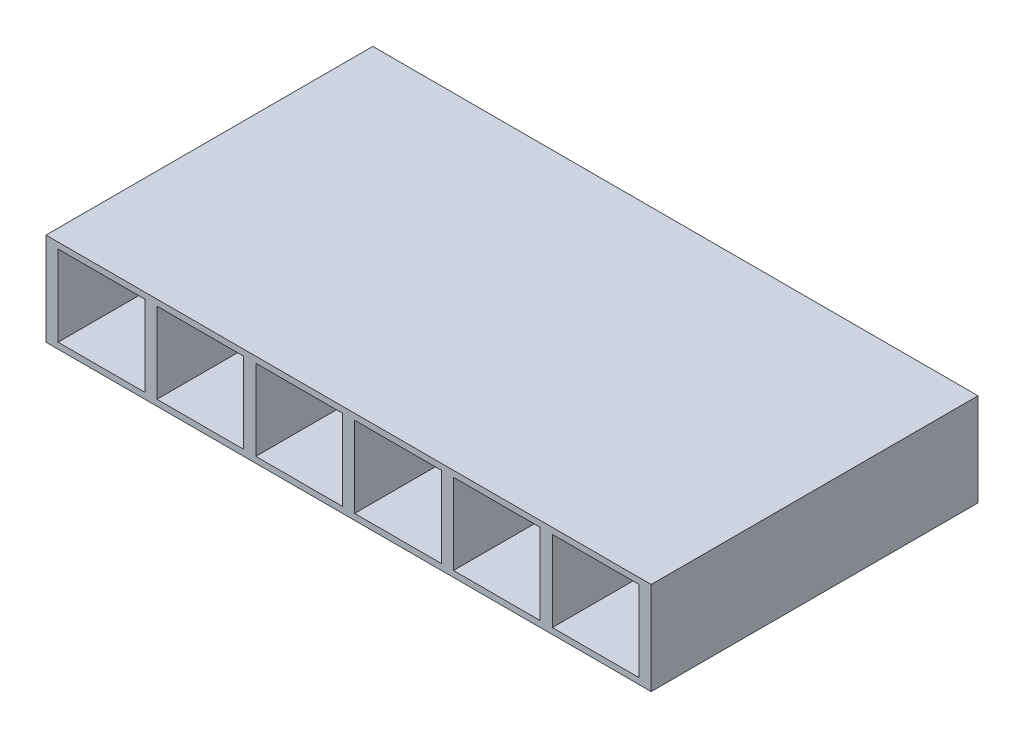
ISO-10303-21;
HEADER;
FILE_DESCRIPTION(('STEP AP214'),'2;1');
FILE_NAME('part.step','',(''),(''),'','','');
FILE_SCHEMA(('AUTOMOTIVE_DESIGN { 1 0 10303 214 1 1 1 1 }'));
ENDSEC;
DATA;
#1=APPLICATION_CONTEXT('core data for automotive mechanical design processes');
#2=APPLICATION_PROTOCOL_DEFINITION('international standard','automotive_design',2000,#1);
#3=PRODUCT_CONTEXT('',#1,'mechanical');
#4=PRODUCT('Part','Part','',(#3));
#5=PRODUCT_RELATED_PRODUCT_CATEGORY('part','',(#4));
#6=PRODUCT_DEFINITION_FORMATION('','',#4);
#7=PRODUCT_DEFINITION_CONTEXT('part definition',#1,'design');
#8=PRODUCT_DEFINITION('design','',#6,#7);
#9=PRODUCT_DEFINITION_SHAPE('','',#8);
#10=(LENGTH_UNIT() NAMED_UNIT(*) SI_UNIT(.MILLI.,.METRE.));
#11=(NAMED_UNIT(*) PLANE_ANGLE_UNIT() SI_UNIT($,.RADIAN.));
#12=(NAMED_UNIT(*) SI_UNIT($,.STERADIAN.) SOLID_ANGLE_UNIT());
#13=UNCERTAINTY_MEASURE_WITH_UNIT(LENGTH_MEASURE(1.E-05),#10,'distance_accuracy_value','');
#14=(GEOMETRIC_REPRESENTATION_CONTEXT(3) GLOBAL_UNCERTAINTY_ASSIGNED_CONTEXT((#13)) GLOBAL_UNIT_ASSIGNED_CONTEXT((#10,
#11,#12)) REPRESENTATION_CONTEXT('',''));
#15=CARTESIAN_POINT('',(0.,0.,0.));
#16=DIRECTION('',(0.,0.,1.));
#17=DIRECTION('',(1.,0.,0.));
#18=AXIS2_PLACEMENT_3D('',#15,#16,#17);
#19=CARTESIAN_POINT('',(0.,0.,8.1));
#20=DIRECTION('',(0.,0.,-1.));
#21=DIRECTION('',(-1.,0.,0.));
#22=AXIS2_PLACEMENT_3D('',#19,#20,#21);
#23=PLANE('',#22);
#24=DIRECTION('',(-1.,0.,0.));
#25=VECTOR('',#24,1.);
#26=CARTESIAN_POINT('',(2.53693586212821,1.,8.1));
#27=LINE('',#26,#25);
#28=CARTESIAN_POINT('',(4.68693586212821,1.,8.1));
#29=VERTEX_POINT('',#28);
#30=CARTESIAN_POINT('',(2.53693586212821,1.,8.1));
#31=VERTEX_POINT('',#30);
#32=EDGE_CURVE('E253',#29,#31,#27,.T.);
#33=ORIENTED_EDGE('',*,*,#32,.F.);
#34=DIRECTION('',(0.,1.,0.));
#35=VECTOR('',#34,1.);
#36=CARTESIAN_POINT('',(4.68693586212821,-1.,8.1));
#37=LINE('',#36,#35);
#38=CARTESIAN_POINT('',(4.68693586212821,-1.,8.1));
#39=VERTEX_POINT('',#38);
#40=EDGE_CURVE('E261',#39,#29,#37,.T.);
#41=ORIENTED_EDGE('',*,*,#40,.F.);
#42=DIRECTION('',(1.,0.,0.));
#43=VECTOR('',#42,1.);
#44=CARTESIAN_POINT('',(2.53693586212821,-1.,8.1));
#45=LINE('',#44,#43);
#46=CARTESIAN_POINT('',(2.53693586212821,-1.,8.1));
#47=VERTEX_POINT('',#46);
#48=EDGE_CURVE('E258',#47,#39,#45,.T.);
#49=ORIENTED_EDGE('',*,*,#48,.F.);
#50=DIRECTION('',(0.,-1.,0.));
#51=VECTOR('',#50,1.);
#52=CARTESIAN_POINT('',(2.53693586212821,-1.,8.1));
#53=LINE('',#52,#51);
#54=EDGE_CURVE('E255',#31,#47,#53,.T.);
#55=ORIENTED_EDGE('',*,*,#54,.F.);
#56=EDGE_LOOP('',(#33,#41,#49,#55));
#57=FACE_BOUND('',#56,.T.);
#58=DIRECTION('',(-1.,0.,0.));
#59=VECTOR('',#58,1.);
#60=CARTESIAN_POINT('',(-2.36306413787179,1.,8.1));
#61=LINE('',#60,#59);
#62=CARTESIAN_POINT('',(-0.213064137871794,1.,8.1));
#63=VERTEX_POINT('',#62);
#64=CARTESIAN_POINT('',(-2.36306413787179,1.,8.1));
#65=VERTEX_POINT('',#64);
#66=EDGE_CURVE('E315',#63,#65,#61,.T.);
#67=ORIENTED_EDGE('',*,*,#66,.F.);
#68=DIRECTION('',(0.,1.,0.));
#69=VECTOR('',#68,1.);
#70=CARTESIAN_POINT('',(-0.213064137871794,-1.,8.1));
#71=LINE('',#70,#69);
#72=CARTESIAN_POINT('',(-0.213064137871794,-1.,8.1));
#73=VERTEX_POINT('',#72);
#74=EDGE_CURVE('E323',#73,#63,#71,.T.);
#75=ORIENTED_EDGE('',*,*,#74,.F.);
#76=DIRECTION('',(1.,0.,0.));
#77=VECTOR('',#76,1.);
#78=CARTESIAN_POINT('',(-2.36306413787179,-1.,8.1));
#79=LINE('',#78,#77);
#80=CARTESIAN_POINT('',(-2.36306413787179,-1.,8.1));
#81=VERTEX_POINT('',#80);
#82=EDGE_CURVE('E320',#81,#73,#79,.T.);
#83=ORIENTED_EDGE('',*,*,#82,.F.);
#84=DIRECTION('',(0.,-1.,0.));
#85=VECTOR('',#84,1.);
#86=CARTESIAN_POINT('',(-2.36306413787179,-1.,8.1));
#87=LINE('',#86,#85);
#88=EDGE_CURVE('E317',#65,#81,#87,.T.);
#89=ORIENTED_EDGE('',*,*,#88,.F.);
#90=EDGE_LOOP('',(#67,#75,#83,#89));
#91=FACE_BOUND('',#90,.T.);
#92=DIRECTION('',(0.,1.,0.));
#93=VECTOR('',#92,1.);
#94=CARTESIAN_POINT('',(-5.11306413787179,-1.,8.1));
#95=LINE('',#94,#93);
#96=CARTESIAN_POINT('',(-5.11306413787179,-1.,8.1));
#97=VERTEX_POINT('',#96);
#98=CARTESIAN_POINT('',(-5.11306413787179,1.,8.1));
#99=VERTEX_POINT('',#98);
#100=EDGE_CURVE('E377',#97,#99,#95,.T.);
#101=ORIENTED_EDGE('',*,*,#100,.F.);
#102=DIRECTION('',(1.,0.,0.));
#103=VECTOR('',#102,1.);
#104=CARTESIAN_POINT('',(-7.26306413787179,-1.,8.1));
#105=LINE('',#104,#103);
#106=CARTESIAN_POINT('',(-7.26306413787179,-1.,8.1));
#107=VERTEX_POINT('',#106);
#108=EDGE_CURVE('E385',#107,#97,#105,.T.);
#109=ORIENTED_EDGE('',*,*,#108,.F.);
#110=DIRECTION('',(0.,-1.,0.));
#111=VECTOR('',#110,1.);
#112=CARTESIAN_POINT('',(-7.26306413787179,-1.,8.1));
#113=LINE('',#112,#111);
#114=CARTESIAN_POINT('',(-7.26306413787179,1.,8.1));
#115=VERTEX_POINT('',#114);
#116=EDGE_CURVE('E382',#115,#107,#113,.T.);
#117=ORIENTED_EDGE('',*,*,#116,.F.);
#118=DIRECTION('',(-1.,0.,0.));
#119=VECTOR('',#118,1.);
#120=CARTESIAN_POINT('',(-7.26306413787179,1.,8.1));
#121=LINE('',#120,#119);
#122=EDGE_CURVE('E379',#99,#115,#121,.T.);
#123=ORIENTED_EDGE('',*,*,#122,.F.);
#124=EDGE_LOOP('',(#101,#109,#117,#123));
#125=FACE_BOUND('',#124,.T.);
#126=DIRECTION('',(0.,1.,0.));
#127=VECTOR('',#126,1.);
#128=CARTESIAN_POINT('',(7.43693586212821,-1.15,8.1));
#129=LINE('',#128,#127);
#130=CARTESIAN_POINT('',(7.43693586212821,-1.15,8.1));
#131=VERTEX_POINT('',#130);
#132=CARTESIAN_POINT('',(7.43693586212821,1.15,8.1));
#133=VERTEX_POINT('',#132);
#134=EDGE_CURVE('E408',#131,#133,#129,.T.);
#135=ORIENTED_EDGE('',*,*,#134,.T.);
#136=DIRECTION('',(-1.,0.,0.));
#137=VECTOR('',#136,1.);
#138=CARTESIAN_POINT('',(-7.56306413787179,1.15,8.1));
#139=LINE('',#138,#137);
#140=CARTESIAN_POINT('',(-7.56306413787179,1.15,8.1));
#141=VERTEX_POINT('',#140);
#142=EDGE_CURVE('E411',#133,#141,#139,.T.);
#143=ORIENTED_EDGE('',*,*,#142,.T.);
#144=DIRECTION('',(0.,-1.,0.));
#145=VECTOR('',#144,1.);
#146=CARTESIAN_POINT('',(-7.5630641378718,-1.15,8.1));
#147=LINE('',#146,#145);
#148=CARTESIAN_POINT('',(-7.5630641378718,-1.15,8.1));
#149=VERTEX_POINT('',#148);
#150=EDGE_CURVE('E414',#141,#149,#147,.T.);
#151=ORIENTED_EDGE('',*,*,#150,.T.);
#152=DIRECTION('',(1.,0.,0.));
#153=VECTOR('',#152,1.);
#154=CARTESIAN_POINT('',(-7.5630641378718,-1.15,8.1));
#155=LINE('',#154,#153);
#156=EDGE_CURVE('E416',#149,#131,#155,.T.);
#157=ORIENTED_EDGE('',*,*,#156,.T.);
#158=EDGE_LOOP('',(#135,#143,#151,#157));
#159=FACE_BOUND('',#158,.T.);
#160=DIRECTION('',(-1.,0.,0.));
#161=VECTOR('',#160,1.);
#162=CARTESIAN_POINT('',(-4.81306413787179,1.,8.1));
#163=LINE('',#162,#161);
#164=CARTESIAN_POINT('',(-2.66306413787179,1.,8.1));
#165=VERTEX_POINT('',#164);
#166=CARTESIAN_POINT('',(-4.81306413787179,1.,8.1));
#167=VERTEX_POINT('',#166);
#168=EDGE_CURVE('E346',#165,#167,#163,.T.);
#169=ORIENTED_EDGE('',*,*,#168,.F.);
#170=DIRECTION('',(0.,1.,0.));
#171=VECTOR('',#170,1.);
#172=CARTESIAN_POINT('',(-2.66306413787179,-1.,8.1));
#173=LINE('',#172,#171);
#174=CARTESIAN_POINT('',(-2.66306413787179,-1.,8.1));
#175=VERTEX_POINT('',#174);
#176=EDGE_CURVE('E354',#175,#165,#173,.T.);
#177=ORIENTED_EDGE('',*,*,#176,.F.);
#178=DIRECTION('',(1.,0.,0.));
#179=VECTOR('',#178,1.);
#180=CARTESIAN_POINT('',(-4.81306413787179,-1.,8.1));
#181=LINE('',#180,#179);
#182=CARTESIAN_POINT('',(-4.81306413787179,-1.,8.1));
#183=VERTEX_POINT('',#182);
#184=EDGE_CURVE('E351',#183,#175,#181,.T.);
#185=ORIENTED_EDGE('',*,*,#184,.F.);
#186=DIRECTION('',(0.,-1.,0.));
#187=VECTOR('',#186,1.);
#188=CARTESIAN_POINT('',(-4.81306413787179,-1.,8.1));
#189=LINE('',#188,#187);
#190=EDGE_CURVE('E348',#167,#183,#189,.T.);
#191=ORIENTED_EDGE('',*,*,#190,.F.);
#192=EDGE_LOOP('',(#169,#177,#185,#191));
#193=FACE_BOUND('',#192,.T.);
#194=DIRECTION('',(-1.,0.,0.));
#195=VECTOR('',#194,1.);
#196=CARTESIAN_POINT('',(0.0869358621282063,1.,8.1));
#197=LINE('',#196,#195);
#198=CARTESIAN_POINT('',(2.23693586212821,1.,8.1));
#199=VERTEX_POINT('',#198);
#200=CARTESIAN_POINT('',(0.0869358621282063,1.,8.1));
#201=VERTEX_POINT('',#200);
#202=EDGE_CURVE('E284',#199,#201,#197,.T.);
#203=ORIENTED_EDGE('',*,*,#202,.F.);
#204=DIRECTION('',(0.,1.,0.));
#205=VECTOR('',#204,1.);
#206=CARTESIAN_POINT('',(2.23693586212821,-1.,8.1));
#207=LINE('',#206,#205);
#208=CARTESIAN_POINT('',(2.23693586212821,-1.,8.1));
#209=VERTEX_POINT('',#208);
#210=EDGE_CURVE('E292',#209,#199,#207,.T.);
#211=ORIENTED_EDGE('',*,*,#210,.F.);
#212=DIRECTION('',(1.,0.,0.));
#213=VECTOR('',#212,1.);
#214=CARTESIAN_POINT('',(0.0869358621282063,-1.,8.1));
#215=LINE('',#214,#213);
#216=CARTESIAN_POINT('',(0.0869358621282063,-1.,8.1));
#217=VERTEX_POINT('',#216);
#218=EDGE_CURVE('E289',#217,#209,#215,.T.);
#219=ORIENTED_EDGE('',*,*,#218,.F.);
#220=DIRECTION('',(0.,-1.,0.));
#221=VECTOR('',#220,1.);
#222=CARTESIAN_POINT('',(0.0869358621282063,-1.,8.1));
#223=LINE('',#222,#221);
#224=EDGE_CURVE('E286',#201,#217,#223,.T.);
#225=ORIENTED_EDGE('',*,*,#224,.F.);
#226=EDGE_LOOP('',(#203,#211,#219,#225));
#227=FACE_BOUND('',#226,.T.);
#228=DIRECTION('',(-1.,0.,0.));
#229=VECTOR('',#228,1.);
#230=CARTESIAN_POINT('',(4.98693586212821,1.,8.1));
#231=LINE('',#230,#229);
#232=CARTESIAN_POINT('',(7.13693586212821,1.,8.1));
#233=VERTEX_POINT('',#232);
#234=CARTESIAN_POINT('',(4.98693586212821,1.,8.1));
#235=VERTEX_POINT('',#234);
#236=EDGE_CURVE('E217',#233,#235,#231,.T.);
#237=ORIENTED_EDGE('',*,*,#236,.F.);
#238=DIRECTION('',(0.,1.,0.));
#239=VECTOR('',#238,1.);
#240=CARTESIAN_POINT('',(7.13693586212821,-1.,8.1));
#241=LINE('',#240,#239);
#242=CARTESIAN_POINT('',(7.13693586212821,-1.,8.1));
#243=VERTEX_POINT('',#242);
#244=EDGE_CURVE('E239',#243,#233,#241,.T.);
#245=ORIENTED_EDGE('',*,*,#244,.F.);
#246=DIRECTION('',(1.,0.,0.));
#247=VECTOR('',#246,1.);
#248=CARTESIAN_POINT('',(4.98693586212821,-1.,8.1));
#249=LINE('',#248,#247);
#250=CARTESIAN_POINT('',(4.98693586212821,-1.,8.1));
#251=VERTEX_POINT('',#250);
#252=EDGE_CURVE('E237',#251,#243,#249,.T.);
#253=ORIENTED_EDGE('',*,*,#252,.F.);
#254=DIRECTION('',(0.,-1.,0.));
#255=VECTOR('',#254,1.);
#256=CARTESIAN_POINT('',(4.98693586212821,-1.,8.1));
#257=LINE('',#256,#255);
#258=EDGE_CURVE('E225',#235,#251,#257,.T.);
#259=ORIENTED_EDGE('',*,*,#258,.F.);
#260=EDGE_LOOP('',(#237,#245,#253,#259));
#261=FACE_BOUND('',#260,.T.);
#262=ADVANCED_FACE('F32',(#57,#91,#125,#159,#193,#227,#261),#23,.F.);
#263=CARTESIAN_POINT('',(0.,0.,0.));
#264=DIRECTION('',(0.,0.,-1.));
#265=DIRECTION('',(-1.,0.,0.));
#266=AXIS2_PLACEMENT_3D('',#263,#264,#265);
#267=PLANE('',#266);
#268=DIRECTION('',(0.,1.,0.));
#269=VECTOR('',#268,1.);
#270=CARTESIAN_POINT('',(7.43693586212821,-1.15,0.));
#271=LINE('',#270,#269);
#272=CARTESIAN_POINT('',(7.43693586212821,-1.15,0.));
#273=VERTEX_POINT('',#272);
#274=CARTESIAN_POINT('',(7.43693586212821,1.15,0.));
#275=VERTEX_POINT('',#274);
#276=EDGE_CURVE('E407',#273,#275,#271,.T.);
#277=ORIENTED_EDGE('',*,*,#276,.F.);
#278=DIRECTION('',(1.,0.,0.));
#279=VECTOR('',#278,1.);
#280=CARTESIAN_POINT('',(-7.5630641378718,-1.15,0.));
#281=LINE('',#280,#279);
#282=CARTESIAN_POINT('',(-7.5630641378718,-1.15,0.));
#283=VERTEX_POINT('',#282);
#284=EDGE_CURVE('E412',#283,#273,#281,.T.);
#285=ORIENTED_EDGE('',*,*,#284,.F.);
#286=DIRECTION('',(0.,-1.,0.));
#287=VECTOR('',#286,1.);
#288=CARTESIAN_POINT('',(-7.5630641378718,-1.15,0.));
#289=LINE('',#288,#287);
#290=CARTESIAN_POINT('',(-7.56306413787179,1.15,0.));
#291=VERTEX_POINT('',#290);
#292=EDGE_CURVE('E423',#291,#283,#289,.T.);
#293=ORIENTED_EDGE('',*,*,#292,.F.);
#294=DIRECTION('',(-1.,0.,0.));
#295=VECTOR('',#294,1.);
#296=CARTESIAN_POINT('',(-7.56306413787179,1.15,0.));
#297=LINE('',#296,#295);
#298=EDGE_CURVE('E421',#275,#291,#297,.T.);
#299=ORIENTED_EDGE('',*,*,#298,.F.);
#300=EDGE_LOOP('',(#277,#285,#293,#299));
#301=FACE_BOUND('',#300,.T.);
#302=DIRECTION('',(1.,0.,0.));
#303=VECTOR('',#302,1.);
#304=CARTESIAN_POINT('',(-7.26306413787179,-1.,0.));
#305=LINE('',#304,#303);
#306=CARTESIAN_POINT('',(-7.26306413787179,-1.,0.));
#307=VERTEX_POINT('',#306);
#308=CARTESIAN_POINT('',(-5.11306413787179,-1.,0.));
#309=VERTEX_POINT('',#308);
#310=EDGE_CURVE('E380',#307,#309,#305,.T.);
#311=ORIENTED_EDGE('',*,*,#310,.T.);
#312=DIRECTION('',(0.,1.,0.));
#313=VECTOR('',#312,1.);
#314=CARTESIAN_POINT('',(-5.11306413787179,-1.,0.));
#315=LINE('',#314,#313);
#316=CARTESIAN_POINT('',(-5.11306413787179,1.,0.));
#317=VERTEX_POINT('',#316);
#318=EDGE_CURVE('E376',#309,#317,#315,.T.);
#319=ORIENTED_EDGE('',*,*,#318,.T.);
#320=DIRECTION('',(-1.,0.,0.));
#321=VECTOR('',#320,1.);
#322=CARTESIAN_POINT('',(-7.26306413787179,1.,0.));
#323=LINE('',#322,#321);
#324=CARTESIAN_POINT('',(-7.26306413787179,1.,0.));
#325=VERTEX_POINT('',#324);
#326=EDGE_CURVE('E390',#317,#325,#323,.T.);
#327=ORIENTED_EDGE('',*,*,#326,.T.);
#328=DIRECTION('',(0.,-1.,0.));
#329=VECTOR('',#328,1.);
#330=CARTESIAN_POINT('',(-7.26306413787179,-1.,0.));
#331=LINE('',#330,#329);
#332=EDGE_CURVE('E393',#325,#307,#331,.T.);
#333=ORIENTED_EDGE('',*,*,#332,.T.);
#334=EDGE_LOOP('',(#311,#319,#327,#333));
#335=FACE_BOUND('',#334,.T.);
#336=DIRECTION('',(0.,1.,0.));
#337=VECTOR('',#336,1.);
#338=CARTESIAN_POINT('',(-2.66306413787179,-1.,0.));
#339=LINE('',#338,#337);
#340=CARTESIAN_POINT('',(-2.66306413787179,-1.,0.));
#341=VERTEX_POINT('',#340);
#342=CARTESIAN_POINT('',(-2.66306413787179,1.,0.));
#343=VERTEX_POINT('',#342);
#344=EDGE_CURVE('E349',#341,#343,#339,.T.);
#345=ORIENTED_EDGE('',*,*,#344,.T.);
#346=DIRECTION('',(-1.,0.,0.));
#347=VECTOR('',#346,1.);
#348=CARTESIAN_POINT('',(-4.81306413787179,1.,0.));
#349=LINE('',#348,#347);
#350=CARTESIAN_POINT('',(-4.81306413787179,1.,0.));
#351=VERTEX_POINT('',#350);
#352=EDGE_CURVE('E345',#343,#351,#349,.T.);
#353=ORIENTED_EDGE('',*,*,#352,.T.);
#354=DIRECTION('',(0.,-1.,0.));
#355=VECTOR('',#354,1.);
#356=CARTESIAN_POINT('',(-4.81306413787179,-1.,0.));
#357=LINE('',#356,#355);
#358=CARTESIAN_POINT('',(-4.81306413787179,-1.,0.));
#359=VERTEX_POINT('',#358);
#360=EDGE_CURVE('E359',#351,#359,#357,.T.);
#361=ORIENTED_EDGE('',*,*,#360,.T.);
#362=DIRECTION('',(1.,0.,0.));
#363=VECTOR('',#362,1.);
#364=CARTESIAN_POINT('',(-4.81306413787179,-1.,0.));
#365=LINE('',#364,#363);
#366=EDGE_CURVE('E362',#359,#341,#365,.T.);
#367=ORIENTED_EDGE('',*,*,#366,.T.);
#368=EDGE_LOOP('',(#345,#353,#361,#367));
#369=FACE_BOUND('',#368,.T.);
#370=DIRECTION('',(0.,1.,0.));
#371=VECTOR('',#370,1.);
#372=CARTESIAN_POINT('',(-0.213064137871794,-1.,0.));
#373=LINE('',#372,#371);
#374=CARTESIAN_POINT('',(-0.213064137871794,-1.,0.));
#375=VERTEX_POINT('',#374);
#376=CARTESIAN_POINT('',(-0.213064137871794,1.,0.));
#377=VERTEX_POINT('',#376);
#378=EDGE_CURVE('E318',#375,#377,#373,.T.);
#379=ORIENTED_EDGE('',*,*,#378,.T.);
#380=DIRECTION('',(-1.,0.,0.));
#381=VECTOR('',#380,1.);
#382=CARTESIAN_POINT('',(-2.36306413787179,1.,0.));
#383=LINE('',#382,#381);
#384=CARTESIAN_POINT('',(-2.36306413787179,1.,0.));
#385=VERTEX_POINT('',#384);
#386=EDGE_CURVE('E314',#377,#385,#383,.T.);
#387=ORIENTED_EDGE('',*,*,#386,.T.);
#388=DIRECTION('',(0.,-1.,0.));
#389=VECTOR('',#388,1.);
#390=CARTESIAN_POINT('',(-2.36306413787179,-1.,0.));
#391=LINE('',#390,#389);
#392=CARTESIAN_POINT('',(-2.36306413787179,-1.,0.));
#393=VERTEX_POINT('',#392);
#394=EDGE_CURVE('E328',#385,#393,#391,.T.);
#395=ORIENTED_EDGE('',*,*,#394,.T.);
#396=DIRECTION('',(1.,0.,0.));
#397=VECTOR('',#396,1.);
#398=CARTESIAN_POINT('',(-2.36306413787179,-1.,0.));
#399=LINE('',#398,#397);
#400=EDGE_CURVE('E331',#393,#375,#399,.T.);
#401=ORIENTED_EDGE('',*,*,#400,.T.);
#402=EDGE_LOOP('',(#379,#387,#395,#401));
#403=FACE_BOUND('',#402,.T.);
#404=DIRECTION('',(0.,1.,0.));
#405=VECTOR('',#404,1.);
#406=CARTESIAN_POINT('',(2.23693586212821,-1.,0.));
#407=LINE('',#406,#405);
#408=CARTESIAN_POINT('',(2.23693586212821,-1.,0.));
#409=VERTEX_POINT('',#408);
#410=CARTESIAN_POINT('',(2.23693586212821,1.,0.));
#411=VERTEX_POINT('',#410);
#412=EDGE_CURVE('E287',#409,#411,#407,.T.);
#413=ORIENTED_EDGE('',*,*,#412,.T.);
#414=DIRECTION('',(-1.,0.,0.));
#415=VECTOR('',#414,1.);
#416=CARTESIAN_POINT('',(0.0869358621282063,1.,0.));
#417=LINE('',#416,#415);
#418=CARTESIAN_POINT('',(0.0869358621282063,1.,0.));
#419=VERTEX_POINT('',#418);
#420=EDGE_CURVE('E283',#411,#419,#417,.T.);
#421=ORIENTED_EDGE('',*,*,#420,.T.);
#422=DIRECTION('',(0.,-1.,0.));
#423=VECTOR('',#422,1.);
#424=CARTESIAN_POINT('',(0.0869358621282063,-1.,0.));
#425=LINE('',#424,#423);
#426=CARTESIAN_POINT('',(0.0869358621282063,-1.,0.));
#427=VERTEX_POINT('',#426);
#428=EDGE_CURVE('E297',#419,#427,#425,.T.);
#429=ORIENTED_EDGE('',*,*,#428,.T.);
#430=DIRECTION('',(1.,0.,0.));
#431=VECTOR('',#430,1.);
#432=CARTESIAN_POINT('',(0.0869358621282063,-1.,0.));
#433=LINE('',#432,#431);
#434=EDGE_CURVE('E300',#427,#409,#433,.T.);
#435=ORIENTED_EDGE('',*,*,#434,.T.);
#436=EDGE_LOOP('',(#413,#421,#429,#435));
#437=FACE_BOUND('',#436,.T.);
#438=DIRECTION('',(0.,1.,0.));
#439=VECTOR('',#438,1.);
#440=CARTESIAN_POINT('',(4.68693586212821,-1.,0.));
#441=LINE('',#440,#439);
#442=CARTESIAN_POINT('',(4.68693586212821,-1.,0.));
#443=VERTEX_POINT('',#442);
#444=CARTESIAN_POINT('',(4.68693586212821,1.,0.));
#445=VERTEX_POINT('',#444);
#446=EDGE_CURVE('E256',#443,#445,#441,.T.);
#447=ORIENTED_EDGE('',*,*,#446,.T.);
#448=DIRECTION('',(-1.,0.,0.));
#449=VECTOR('',#448,1.);
#450=CARTESIAN_POINT('',(2.53693586212821,1.,0.));
#451=LINE('',#450,#449);
#452=CARTESIAN_POINT('',(2.53693586212821,1.,0.));
#453=VERTEX_POINT('',#452);
#454=EDGE_CURVE('E233',#445,#453,#451,.T.);
#455=ORIENTED_EDGE('',*,*,#454,.T.);
#456=DIRECTION('',(0.,-1.,0.));
#457=VECTOR('',#456,1.);
#458=CARTESIAN_POINT('',(2.53693586212821,-1.,0.));
#459=LINE('',#458,#457);
#460=CARTESIAN_POINT('',(2.53693586212821,-1.,0.));
#461=VERTEX_POINT('',#460);
#462=EDGE_CURVE('E266',#453,#461,#459,.T.);
#463=ORIENTED_EDGE('',*,*,#462,.T.);
#464=DIRECTION('',(1.,0.,0.));
#465=VECTOR('',#464,1.);
#466=CARTESIAN_POINT('',(2.53693586212821,-1.,0.));
#467=LINE('',#466,#465);
#468=EDGE_CURVE('E269',#461,#443,#467,.T.);
#469=ORIENTED_EDGE('',*,*,#468,.T.);
#470=EDGE_LOOP('',(#447,#455,#463,#469));
#471=FACE_BOUND('',#470,.T.);
#472=DIRECTION('',(0.,1.,0.));
#473=VECTOR('',#472,1.);
#474=CARTESIAN_POINT('',(7.13693586212821,-1.,0.));
#475=LINE('',#474,#473);
#476=CARTESIAN_POINT('',(7.13693586212821,-1.,0.));
#477=VERTEX_POINT('',#476);
#478=CARTESIAN_POINT('',(7.13693586212821,1.,0.));
#479=VERTEX_POINT('',#478);
#480=EDGE_CURVE('E226',#477,#479,#475,.T.);
#481=ORIENTED_EDGE('',*,*,#480,.T.);
#482=DIRECTION('',(-1.,0.,0.));
#483=VECTOR('',#482,1.);
#484=CARTESIAN_POINT('',(4.98693586212821,1.,0.));
#485=LINE('',#484,#483);
#486=CARTESIAN_POINT('',(4.98693586212821,1.,0.));
#487=VERTEX_POINT('',#486);
#488=EDGE_CURVE('E55',#479,#487,#485,.T.);
#489=ORIENTED_EDGE('',*,*,#488,.T.);
#490=DIRECTION('',(0.,-1.,0.));
#491=VECTOR('',#490,1.);
#492=CARTESIAN_POINT('',(4.98693586212821,-1.,0.));
#493=LINE('',#492,#491);
#494=CARTESIAN_POINT('',(4.98693586212821,-1.,0.));
#495=VERTEX_POINT('',#494);
#496=EDGE_CURVE('E232',#487,#495,#493,.T.);
#497=ORIENTED_EDGE('',*,*,#496,.T.);
#498=DIRECTION('',(1.,0.,0.));
#499=VECTOR('',#498,1.);
#500=CARTESIAN_POINT('',(4.98693586212821,-1.,0.));
#501=LINE('',#500,#499);
#502=EDGE_CURVE('E245',#495,#477,#501,.T.);
#503=ORIENTED_EDGE('',*,*,#502,.T.);
#504=EDGE_LOOP('',(#481,#489,#497,#503));
#505=FACE_BOUND('',#504,.T.);
#506=ADVANCED_FACE('F441',(#301,#335,#369,#403,#437,#471,#505),#267,.T.);
#507=CARTESIAN_POINT('',(7.43693586212821,-1.15,8.1));
#508=DIRECTION('',(-1.,0.,0.));
#509=DIRECTION('',(0.,-1.,0.));
#510=AXIS2_PLACEMENT_3D('',#507,#508,#509);
#511=PLANE('',#510);
#512=ORIENTED_EDGE('',*,*,#276,.T.);
#513=DIRECTION('',(0.,0.,-1.));
#514=VECTOR('',#513,1.);
#515=CARTESIAN_POINT('',(7.43693586212821,1.15,8.1));
#516=LINE('',#515,#514);
#517=EDGE_CURVE('E11',#133,#275,#516,.T.);
#518=ORIENTED_EDGE('',*,*,#517,.F.);
#519=ORIENTED_EDGE('',*,*,#134,.F.);
#520=DIRECTION('',(0.,0.,-1.));
#521=VECTOR('',#520,1.);
#522=CARTESIAN_POINT('',(7.43693586212821,-1.15,8.1));
#523=LINE('',#522,#521);
#524=EDGE_CURVE('E418',#131,#273,#523,.T.);
#525=ORIENTED_EDGE('',*,*,#524,.T.);
#526=EDGE_LOOP('',(#512,#518,#519,#525));
#527=FACE_BOUND('',#526,.T.);
#528=ADVANCED_FACE('F34',(#527),#511,.F.);
#529=CARTESIAN_POINT('',(-7.56306413787179,1.15,8.1));
#530=DIRECTION('',(0.,-1.,0.));
#531=DIRECTION('',(0.,0.,-1.));
#532=AXIS2_PLACEMENT_3D('',#529,#530,#531);
#533=PLANE('',#532);
#534=ORIENTED_EDGE('',*,*,#298,.T.);
#535=DIRECTION('',(0.,0.,-1.));
#536=VECTOR('',#535,1.);
#537=CARTESIAN_POINT('',(-7.56306413787179,1.15,8.1));
#538=LINE('',#537,#536);
#539=EDGE_CURVE('E40',#141,#291,#538,.T.);
#540=ORIENTED_EDGE('',*,*,#539,.F.);
#541=ORIENTED_EDGE('',*,*,#142,.F.);
#542=ORIENTED_EDGE('',*,*,#517,.T.);
#543=EDGE_LOOP('',(#534,#540,#541,#542));
#544=FACE_BOUND('',#543,.T.);
#545=ADVANCED_FACE('F452',(#544),#533,.F.);
#546=CARTESIAN_POINT('',(-7.5630641378718,-1.15,8.1));
#547=DIRECTION('',(1.,0.,0.));
#548=DIRECTION('',(0.,1.,0.));
#549=AXIS2_PLACEMENT_3D('',#546,#547,#548);
#550=PLANE('',#549);
#551=ORIENTED_EDGE('',*,*,#292,.T.);
#552=DIRECTION('',(0.,0.,-1.));
#553=VECTOR('',#552,1.);
#554=CARTESIAN_POINT('',(-7.5630641378718,-1.15,8.1));
#555=LINE('',#554,#553);
#556=EDGE_CURVE('E428',#149,#283,#555,.T.);
#557=ORIENTED_EDGE('',*,*,#556,.F.);
#558=ORIENTED_EDGE('',*,*,#150,.F.);
#559=ORIENTED_EDGE('',*,*,#539,.T.);
#560=EDGE_LOOP('',(#551,#557,#558,#559));
#561=FACE_BOUND('',#560,.T.);
#562=ADVANCED_FACE('F435',(#561),#550,.F.);
#563=CARTESIAN_POINT('',(-7.5630641378718,-1.15,8.1));
#564=DIRECTION('',(0.,1.,0.));
#565=DIRECTION('',(0.,0.,1.));
#566=AXIS2_PLACEMENT_3D('',#563,#564,#565);
#567=PLANE('',#566);
#568=ORIENTED_EDGE('',*,*,#284,.T.);
#569=ORIENTED_EDGE('',*,*,#524,.F.);
#570=ORIENTED_EDGE('',*,*,#156,.F.);
#571=ORIENTED_EDGE('',*,*,#556,.T.);
#572=EDGE_LOOP('',(#568,#569,#570,#571));
#573=FACE_BOUND('',#572,.T.);
#574=ADVANCED_FACE('F445',(#573),#567,.F.);
#575=CARTESIAN_POINT('',(-5.11306413787179,-1.,8.1));
#576=DIRECTION('',(-1.,0.,0.));
#577=DIRECTION('',(0.,0.,1.));
#578=AXIS2_PLACEMENT_3D('',#575,#576,#577);
#579=PLANE('',#578);
#580=ORIENTED_EDGE('',*,*,#318,.F.);
#581=DIRECTION('',(0.,0.,-1.));
#582=VECTOR('',#581,1.);
#583=CARTESIAN_POINT('',(-5.11306413787179,-1.,8.1));
#584=LINE('',#583,#582);
#585=EDGE_CURVE('E387',#97,#309,#584,.T.);
#586=ORIENTED_EDGE('',*,*,#585,.F.);
#587=ORIENTED_EDGE('',*,*,#100,.T.);
#588=DIRECTION('',(0.,0.,-1.));
#589=VECTOR('',#588,1.);
#590=CARTESIAN_POINT('',(-5.11306413787179,1.,8.1));
#591=LINE('',#590,#589);
#592=EDGE_CURVE('E404',#99,#317,#591,.T.);
#593=ORIENTED_EDGE('',*,*,#592,.T.);
#594=EDGE_LOOP('',(#580,#586,#587,#593));
#595=FACE_BOUND('',#594,.T.);
#596=ADVANCED_FACE('F469',(#595),#579,.T.);
#597=CARTESIAN_POINT('',(-7.26306413787179,1.,8.1));
#598=DIRECTION('',(0.,-1.,0.));
#599=DIRECTION('',(0.,0.,-1.));
#600=AXIS2_PLACEMENT_3D('',#597,#598,#599);
#601=PLANE('',#600);
#602=ORIENTED_EDGE('',*,*,#326,.F.);
#603=ORIENTED_EDGE('',*,*,#592,.F.);
#604=ORIENTED_EDGE('',*,*,#122,.T.);
#605=DIRECTION('',(0.,0.,-1.));
#606=VECTOR('',#605,1.);
#607=CARTESIAN_POINT('',(-7.26306413787179,1.,8.1));
#608=LINE('',#607,#606);
#609=EDGE_CURVE('E402',#115,#325,#608,.T.);
#610=ORIENTED_EDGE('',*,*,#609,.T.);
#611=EDGE_LOOP('',(#602,#603,#604,#610));
#612=FACE_BOUND('',#611,.T.);
#613=ADVANCED_FACE('F476',(#612),#601,.T.);
#614=CARTESIAN_POINT('',(-7.26306413787179,-1.,8.1));
#615=DIRECTION('',(1.,0.,0.));
#616=DIRECTION('',(0.,0.,-1.));
#617=AXIS2_PLACEMENT_3D('',#614,#615,#616);
#618=PLANE('',#617);
#619=ORIENTED_EDGE('',*,*,#332,.F.);
#620=ORIENTED_EDGE('',*,*,#609,.F.);
#621=ORIENTED_EDGE('',*,*,#116,.T.);
#622=DIRECTION('',(0.,0.,-1.));
#623=VECTOR('',#622,1.);
#624=CARTESIAN_POINT('',(-7.26306413787179,-1.,8.1));
#625=LINE('',#624,#623);
#626=EDGE_CURVE('E400',#107,#307,#625,.T.);
#627=ORIENTED_EDGE('',*,*,#626,.T.);
#628=EDGE_LOOP('',(#619,#620,#621,#627));
#629=FACE_BOUND('',#628,.T.);
#630=ADVANCED_FACE('F481',(#629),#618,.T.);
#631=CARTESIAN_POINT('',(-7.26306413787179,-1.,8.1));
#632=DIRECTION('',(0.,1.,0.));
#633=DIRECTION('',(0.,0.,1.));
#634=AXIS2_PLACEMENT_3D('',#631,#632,#633);
#635=PLANE('',#634);
#636=ORIENTED_EDGE('',*,*,#310,.F.);
#637=ORIENTED_EDGE('',*,*,#626,.F.);
#638=ORIENTED_EDGE('',*,*,#108,.T.);
#639=ORIENTED_EDGE('',*,*,#585,.T.);
#640=EDGE_LOOP('',(#636,#637,#638,#639));
#641=FACE_BOUND('',#640,.T.);
#642=ADVANCED_FACE('F488',(#641),#635,.T.);
#643=CARTESIAN_POINT('',(-4.81306413787179,1.,8.1));
#644=DIRECTION('',(0.,-1.,0.));
#645=DIRECTION('',(0.,0.,-1.));
#646=AXIS2_PLACEMENT_3D('',#643,#644,#645);
#647=PLANE('',#646);
#648=ORIENTED_EDGE('',*,*,#352,.F.);
#649=DIRECTION('',(0.,0.,-1.));
#650=VECTOR('',#649,1.);
#651=CARTESIAN_POINT('',(-2.66306413787179,1.,8.1));
#652=LINE('',#651,#650);
#653=EDGE_CURVE('E356',#165,#343,#652,.T.);
#654=ORIENTED_EDGE('',*,*,#653,.F.);
#655=ORIENTED_EDGE('',*,*,#168,.T.);
#656=DIRECTION('',(0.,0.,-1.));
#657=VECTOR('',#656,1.);
#658=CARTESIAN_POINT('',(-4.81306413787179,1.,8.1));
#659=LINE('',#658,#657);
#660=EDGE_CURVE('E373',#167,#351,#659,.T.);
#661=ORIENTED_EDGE('',*,*,#660,.T.);
#662=EDGE_LOOP('',(#648,#654,#655,#661));
#663=FACE_BOUND('',#662,.T.);
#664=ADVANCED_FACE('F502',(#663),#647,.T.);
#665=CARTESIAN_POINT('',(-4.81306413787179,-1.,8.1));
#666=DIRECTION('',(1.,0.,0.));
#667=DIRECTION('',(0.,0.,-1.));
#668=AXIS2_PLACEMENT_3D('',#665,#666,#667);
#669=PLANE('',#668);
#670=ORIENTED_EDGE('',*,*,#360,.F.);
#671=ORIENTED_EDGE('',*,*,#660,.F.);
#672=ORIENTED_EDGE('',*,*,#190,.T.);
#673=DIRECTION('',(0.,0.,-1.));
#674=VECTOR('',#673,1.);
#675=CARTESIAN_POINT('',(-4.81306413787179,-1.,8.1));
#676=LINE('',#675,#674);
#677=EDGE_CURVE('E371',#183,#359,#676,.T.);
#678=ORIENTED_EDGE('',*,*,#677,.T.);
#679=EDGE_LOOP('',(#670,#671,#672,#678));
#680=FACE_BOUND('',#679,.T.);
#681=ADVANCED_FACE('F507',(#680),#669,.T.);
#682=CARTESIAN_POINT('',(-4.81306413787179,-1.,8.1));
#683=DIRECTION('',(0.,1.,0.));
#684=DIRECTION('',(0.,0.,1.));
#685=AXIS2_PLACEMENT_3D('',#682,#683,#684);
#686=PLANE('',#685);
#687=ORIENTED_EDGE('',*,*,#366,.F.);
#688=ORIENTED_EDGE('',*,*,#677,.F.);
#689=ORIENTED_EDGE('',*,*,#184,.T.);
#690=DIRECTION('',(0.,0.,-1.));
#691=VECTOR('',#690,1.);
#692=CARTESIAN_POINT('',(-2.66306413787179,-1.,8.1));
#693=LINE('',#692,#691);
#694=EDGE_CURVE('E369',#175,#341,#693,.T.);
#695=ORIENTED_EDGE('',*,*,#694,.T.);
#696=EDGE_LOOP('',(#687,#688,#689,#695));
#697=FACE_BOUND('',#696,.T.);
#698=ADVANCED_FACE('F511',(#697),#686,.T.);
#699=CARTESIAN_POINT('',(-2.66306413787179,-1.,8.1));
#700=DIRECTION('',(-1.,0.,0.));
#701=DIRECTION('',(0.,0.,1.));
#702=AXIS2_PLACEMENT_3D('',#699,#700,#701);
#703=PLANE('',#702);
#704=ORIENTED_EDGE('',*,*,#344,.F.);
#705=ORIENTED_EDGE('',*,*,#694,.F.);
#706=ORIENTED_EDGE('',*,*,#176,.T.);
#707=ORIENTED_EDGE('',*,*,#653,.T.);
#708=EDGE_LOOP('',(#704,#705,#706,#707));
#709=FACE_BOUND('',#708,.T.);
#710=ADVANCED_FACE('F515',(#709),#703,.T.);
#711=CARTESIAN_POINT('',(-2.36306413787179,1.,8.1));
#712=DIRECTION('',(0.,-1.,0.));
#713=DIRECTION('',(0.,0.,-1.));
#714=AXIS2_PLACEMENT_3D('',#711,#712,#713);
#715=PLANE('',#714);
#716=ORIENTED_EDGE('',*,*,#386,.F.);
#717=DIRECTION('',(0.,0.,-1.));
#718=VECTOR('',#717,1.);
#719=CARTESIAN_POINT('',(-0.213064137871794,1.,8.1));
#720=LINE('',#719,#718);
#721=EDGE_CURVE('E325',#63,#377,#720,.T.);
#722=ORIENTED_EDGE('',*,*,#721,.F.);
#723=ORIENTED_EDGE('',*,*,#66,.T.);
#724=DIRECTION('',(0.,0.,-1.));
#725=VECTOR('',#724,1.);
#726=CARTESIAN_POINT('',(-2.36306413787179,1.,8.1));
#727=LINE('',#726,#725);
#728=EDGE_CURVE('E342',#65,#385,#727,.T.);
#729=ORIENTED_EDGE('',*,*,#728,.T.);
#730=EDGE_LOOP('',(#716,#722,#723,#729));
#731=FACE_BOUND('',#730,.T.);
#732=ADVANCED_FACE('F519',(#731),#715,.T.);
#733=CARTESIAN_POINT('',(-2.36306413787179,-1.,8.1));
#734=DIRECTION('',(1.,0.,0.));
#735=DIRECTION('',(0.,0.,-1.));
#736=AXIS2_PLACEMENT_3D('',#733,#734,#735);
#737=PLANE('',#736);
#738=ORIENTED_EDGE('',*,*,#394,.F.);
#739=ORIENTED_EDGE('',*,*,#728,.F.);
#740=ORIENTED_EDGE('',*,*,#88,.T.);
#741=DIRECTION('',(0.,0.,-1.));
#742=VECTOR('',#741,1.);
#743=CARTESIAN_POINT('',(-2.36306413787179,-1.,8.1));
#744=LINE('',#743,#742);
#745=EDGE_CURVE('E340',#81,#393,#744,.T.);
#746=ORIENTED_EDGE('',*,*,#745,.T.);
#747=EDGE_LOOP('',(#738,#739,#740,#746));
#748=FACE_BOUND('',#747,.T.);
#749=ADVANCED_FACE('F523',(#748),#737,.T.);
#750=CARTESIAN_POINT('',(-2.36306413787179,-1.,8.1));
#751=DIRECTION('',(0.,1.,0.));
#752=DIRECTION('',(0.,0.,1.));
#753=AXIS2_PLACEMENT_3D('',#750,#751,#752);
#754=PLANE('',#753);
#755=ORIENTED_EDGE('',*,*,#400,.F.);
#756=ORIENTED_EDGE('',*,*,#745,.F.);
#757=ORIENTED_EDGE('',*,*,#82,.T.);
#758=DIRECTION('',(0.,0.,-1.));
#759=VECTOR('',#758,1.);
#760=CARTESIAN_POINT('',(-0.213064137871794,-1.,8.1));
#761=LINE('',#760,#759);
#762=EDGE_CURVE('E338',#73,#375,#761,.T.);
#763=ORIENTED_EDGE('',*,*,#762,.T.);
#764=EDGE_LOOP('',(#755,#756,#757,#763));
#765=FACE_BOUND('',#764,.T.);
#766=ADVANCED_FACE('F527',(#765),#754,.T.);
#767=CARTESIAN_POINT('',(-0.213064137871794,-1.,8.1));
#768=DIRECTION('',(-1.,0.,0.));
#769=DIRECTION('',(0.,0.,1.));
#770=AXIS2_PLACEMENT_3D('',#767,#768,#769);
#771=PLANE('',#770);
#772=ORIENTED_EDGE('',*,*,#378,.F.);
#773=ORIENTED_EDGE('',*,*,#762,.F.);
#774=ORIENTED_EDGE('',*,*,#74,.T.);
#775=ORIENTED_EDGE('',*,*,#721,.T.);
#776=EDGE_LOOP('',(#772,#773,#774,#775));
#777=FACE_BOUND('',#776,.T.);
#778=ADVANCED_FACE('F531',(#777),#771,.T.);
#779=CARTESIAN_POINT('',(0.0869358621282063,1.,8.1));
#780=DIRECTION('',(0.,-1.,0.));
#781=DIRECTION('',(0.,0.,-1.));
#782=AXIS2_PLACEMENT_3D('',#779,#780,#781);
#783=PLANE('',#782);
#784=ORIENTED_EDGE('',*,*,#420,.F.);
#785=DIRECTION('',(0.,0.,-1.));
#786=VECTOR('',#785,1.);
#787=CARTESIAN_POINT('',(2.23693586212821,1.,8.1));
#788=LINE('',#787,#786);
#789=EDGE_CURVE('E294',#199,#411,#788,.T.);
#790=ORIENTED_EDGE('',*,*,#789,.F.);
#791=ORIENTED_EDGE('',*,*,#202,.T.);
#792=DIRECTION('',(0.,0.,-1.));
#793=VECTOR('',#792,1.);
#794=CARTESIAN_POINT('',(0.0869358621282063,1.,8.1));
#795=LINE('',#794,#793);
#796=EDGE_CURVE('E311',#201,#419,#795,.T.);
#797=ORIENTED_EDGE('',*,*,#796,.T.);
#798=EDGE_LOOP('',(#784,#790,#791,#797));
#799=FACE_BOUND('',#798,.T.);
#800=ADVANCED_FACE('F535',(#799),#783,.T.);
#801=CARTESIAN_POINT('',(0.0869358621282063,-1.,8.1));
#802=DIRECTION('',(1.,0.,0.));
#803=DIRECTION('',(0.,0.,-1.));
#804=AXIS2_PLACEMENT_3D('',#801,#802,#803);
#805=PLANE('',#804);
#806=ORIENTED_EDGE('',*,*,#428,.F.);
#807=ORIENTED_EDGE('',*,*,#796,.F.);
#808=ORIENTED_EDGE('',*,*,#224,.T.);
#809=DIRECTION('',(0.,0.,-1.));
#810=VECTOR('',#809,1.);
#811=CARTESIAN_POINT('',(0.0869358621282063,-1.,8.1));
#812=LINE('',#811,#810);
#813=EDGE_CURVE('E309',#217,#427,#812,.T.);
#814=ORIENTED_EDGE('',*,*,#813,.T.);
#815=EDGE_LOOP('',(#806,#807,#808,#814));
#816=FACE_BOUND('',#815,.T.);
#817=ADVANCED_FACE('F539',(#816),#805,.T.);
#818=CARTESIAN_POINT('',(0.0869358621282063,-1.,8.1));
#819=DIRECTION('',(0.,1.,0.));
#820=DIRECTION('',(0.,0.,1.));
#821=AXIS2_PLACEMENT_3D('',#818,#819,#820);
#822=PLANE('',#821);
#823=ORIENTED_EDGE('',*,*,#434,.F.);
#824=ORIENTED_EDGE('',*,*,#813,.F.);
#825=ORIENTED_EDGE('',*,*,#218,.T.);
#826=DIRECTION('',(0.,0.,-1.));
#827=VECTOR('',#826,1.);
#828=CARTESIAN_POINT('',(2.23693586212821,-1.,8.1));
#829=LINE('',#828,#827);
#830=EDGE_CURVE('E307',#209,#409,#829,.T.);
#831=ORIENTED_EDGE('',*,*,#830,.T.);
#832=EDGE_LOOP('',(#823,#824,#825,#831));
#833=FACE_BOUND('',#832,.T.);
#834=ADVANCED_FACE('F543',(#833),#822,.T.);
#835=CARTESIAN_POINT('',(2.23693586212821,-1.,8.1));
#836=DIRECTION('',(-1.,0.,0.));
#837=DIRECTION('',(0.,0.,1.));
#838=AXIS2_PLACEMENT_3D('',#835,#836,#837);
#839=PLANE('',#838);
#840=ORIENTED_EDGE('',*,*,#412,.F.);
#841=ORIENTED_EDGE('',*,*,#830,.F.);
#842=ORIENTED_EDGE('',*,*,#210,.T.);
#843=ORIENTED_EDGE('',*,*,#789,.T.);
#844=EDGE_LOOP('',(#840,#841,#842,#843));
#845=FACE_BOUND('',#844,.T.);
#846=ADVANCED_FACE('F547',(#845),#839,.T.);
#847=CARTESIAN_POINT('',(2.53693586212821,1.,8.1));
#848=DIRECTION('',(0.,-1.,0.));
#849=DIRECTION('',(0.,0.,-1.));
#850=AXIS2_PLACEMENT_3D('',#847,#848,#849);
#851=PLANE('',#850);
#852=ORIENTED_EDGE('',*,*,#454,.F.);
#853=DIRECTION('',(0.,0.,-1.));
#854=VECTOR('',#853,1.);
#855=CARTESIAN_POINT('',(4.68693586212821,1.,8.1));
#856=LINE('',#855,#854);
#857=EDGE_CURVE('E263',#29,#445,#856,.T.);
#858=ORIENTED_EDGE('',*,*,#857,.F.);
#859=ORIENTED_EDGE('',*,*,#32,.T.);
#860=DIRECTION('',(0.,0.,-1.));
#861=VECTOR('',#860,1.);
#862=CARTESIAN_POINT('',(2.53693586212821,1.,8.1));
#863=LINE('',#862,#861);
#864=EDGE_CURVE('E280',#31,#453,#863,.T.);
#865=ORIENTED_EDGE('',*,*,#864,.T.);
#866=EDGE_LOOP('',(#852,#858,#859,#865));
#867=FACE_BOUND('',#866,.T.);
#868=ADVANCED_FACE('F551',(#867),#851,.T.);
#869=CARTESIAN_POINT('',(2.53693586212821,-1.,8.1));
#870=DIRECTION('',(1.,0.,0.));
#871=DIRECTION('',(0.,0.,-1.));
#872=AXIS2_PLACEMENT_3D('',#869,#870,#871);
#873=PLANE('',#872);
#874=ORIENTED_EDGE('',*,*,#462,.F.);
#875=ORIENTED_EDGE('',*,*,#864,.F.);
#876=ORIENTED_EDGE('',*,*,#54,.T.);
#877=DIRECTION('',(0.,0.,-1.));
#878=VECTOR('',#877,1.);
#879=CARTESIAN_POINT('',(2.53693586212821,-1.,8.1));
#880=LINE('',#879,#878);
#881=EDGE_CURVE('E278',#47,#461,#880,.T.);
#882=ORIENTED_EDGE('',*,*,#881,.T.);
#883=EDGE_LOOP('',(#874,#875,#876,#882));
#884=FACE_BOUND('',#883,.T.);
#885=ADVANCED_FACE('F555',(#884),#873,.T.);
#886=CARTESIAN_POINT('',(2.53693586212821,-1.,8.1));
#887=DIRECTION('',(0.,1.,0.));
#888=DIRECTION('',(0.,0.,1.));
#889=AXIS2_PLACEMENT_3D('',#886,#887,#888);
#890=PLANE('',#889);
#891=ORIENTED_EDGE('',*,*,#468,.F.);
#892=ORIENTED_EDGE('',*,*,#881,.F.);
#893=ORIENTED_EDGE('',*,*,#48,.T.);
#894=DIRECTION('',(0.,0.,-1.));
#895=VECTOR('',#894,1.);
#896=CARTESIAN_POINT('',(4.68693586212821,-1.,8.1));
#897=LINE('',#896,#895);
#898=EDGE_CURVE('E276',#39,#443,#897,.T.);
#899=ORIENTED_EDGE('',*,*,#898,.T.);
#900=EDGE_LOOP('',(#891,#892,#893,#899));
#901=FACE_BOUND('',#900,.T.);
#902=ADVANCED_FACE('F559',(#901),#890,.T.);
#903=CARTESIAN_POINT('',(4.68693586212821,-1.,8.1));
#904=DIRECTION('',(-1.,0.,0.));
#905=DIRECTION('',(0.,0.,1.));
#906=AXIS2_PLACEMENT_3D('',#903,#904,#905);
#907=PLANE('',#906);
#908=ORIENTED_EDGE('',*,*,#446,.F.);
#909=ORIENTED_EDGE('',*,*,#898,.F.);
#910=ORIENTED_EDGE('',*,*,#40,.T.);
#911=ORIENTED_EDGE('',*,*,#857,.T.);
#912=EDGE_LOOP('',(#908,#909,#910,#911));
#913=FACE_BOUND('',#912,.T.);
#914=ADVANCED_FACE('F563',(#913),#907,.T.);
#915=CARTESIAN_POINT('',(4.98693586212821,1.,8.1));
#916=DIRECTION('',(0.,-1.,0.));
#917=DIRECTION('',(0.,0.,-1.));
#918=AXIS2_PLACEMENT_3D('',#915,#916,#917);
#919=PLANE('',#918);
#920=ORIENTED_EDGE('',*,*,#488,.F.);
#921=DIRECTION('',(0.,0.,-1.));
#922=VECTOR('',#921,1.);
#923=CARTESIAN_POINT('',(7.13693586212821,1.,8.1));
#924=LINE('',#923,#922);
#925=EDGE_CURVE('E221',#233,#479,#924,.T.);
#926=ORIENTED_EDGE('',*,*,#925,.F.);
#927=ORIENTED_EDGE('',*,*,#236,.T.);
#928=DIRECTION('',(0.,0.,-1.));
#929=VECTOR('',#928,1.);
#930=CARTESIAN_POINT('',(4.98693586212821,1.,8.1));
#931=LINE('',#930,#929);
#932=EDGE_CURVE('E220',#235,#487,#931,.T.);
#933=ORIENTED_EDGE('',*,*,#932,.T.);
#934=EDGE_LOOP('',(#920,#926,#927,#933));
#935=FACE_BOUND('',#934,.T.);
#936=ADVANCED_FACE('F219',(#935),#919,.T.);
#937=CARTESIAN_POINT('',(4.98693586212821,-1.,8.1));
#938=DIRECTION('',(1.,0.,0.));
#939=DIRECTION('',(0.,0.,-1.));
#940=AXIS2_PLACEMENT_3D('',#937,#938,#939);
#941=PLANE('',#940);
#942=ORIENTED_EDGE('',*,*,#496,.F.);
#943=ORIENTED_EDGE('',*,*,#932,.F.);
#944=ORIENTED_EDGE('',*,*,#258,.T.);
#945=DIRECTION('',(0.,0.,-1.));
#946=VECTOR('',#945,1.);
#947=CARTESIAN_POINT('',(4.98693586212821,-1.,8.1));
#948=LINE('',#947,#946);
#949=EDGE_CURVE('E234',#251,#495,#948,.T.);
#950=ORIENTED_EDGE('',*,*,#949,.T.);
#951=EDGE_LOOP('',(#942,#943,#944,#950));
#952=FACE_BOUND('',#951,.T.);
#953=ADVANCED_FACE('F229',(#952),#941,.T.);
#954=CARTESIAN_POINT('',(4.98693586212821,-1.,8.1));
#955=DIRECTION('',(0.,1.,0.));
#956=DIRECTION('',(0.,0.,1.));
#957=AXIS2_PLACEMENT_3D('',#954,#955,#956);
#958=PLANE('',#957);
#959=ORIENTED_EDGE('',*,*,#502,.F.);
#960=ORIENTED_EDGE('',*,*,#949,.F.);
#961=ORIENTED_EDGE('',*,*,#252,.T.);
#962=DIRECTION('',(0.,0.,-1.));
#963=VECTOR('',#962,1.);
#964=CARTESIAN_POINT('',(7.13693586212821,-1.,8.1));
#965=LINE('',#964,#963);
#966=EDGE_CURVE('E47',#243,#477,#965,.T.);
#967=ORIENTED_EDGE('',*,*,#966,.T.);
#968=EDGE_LOOP('',(#959,#960,#961,#967));
#969=FACE_BOUND('',#968,.T.);
#970=ADVANCED_FACE('F572',(#969),#958,.T.);
#971=CARTESIAN_POINT('',(7.13693586212821,-1.,8.1));
#972=DIRECTION('',(-1.,0.,0.));
#973=DIRECTION('',(0.,0.,1.));
#974=AXIS2_PLACEMENT_3D('',#971,#972,#973);
#975=PLANE('',#974);
#976=ORIENTED_EDGE('',*,*,#480,.F.);
#977=ORIENTED_EDGE('',*,*,#966,.F.);
#978=ORIENTED_EDGE('',*,*,#244,.T.);
#979=ORIENTED_EDGE('',*,*,#925,.T.);
#980=EDGE_LOOP('',(#976,#977,#978,#979));
#981=FACE_BOUND('',#980,.T.);
#982=ADVANCED_FACE('F575',(#981),#975,.T.);
#983=CLOSED_SHELL('',(#262,#506,#528,#545,#562,#574,#596,#613,#630,#642,#664,#681,#698,#710,
#732,#749,#766,#778,#800,#817,#834,#846,#868,#885,#902,#914,#936,#953,#970,#982));
#984=MANIFOLD_SOLID_BREP('B2',#983);
#985=ADVANCED_BREP_SHAPE_REPRESENTATION('',(#18,#984),#14);
#986=SHAPE_DEFINITION_REPRESENTATION(#9,#985);
ENDSEC;
END-ISO-10303-21;
